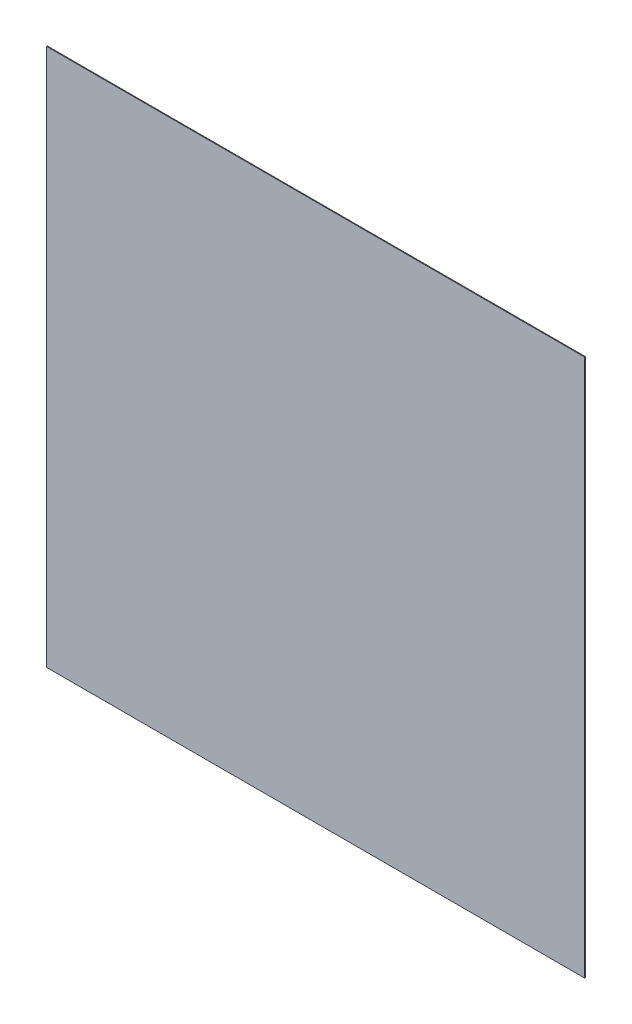
ISO-10303-21;
HEADER;
FILE_DESCRIPTION(('STEP AP214'),'2;1');
FILE_NAME('part.step','',(''),(''),'','','');
FILE_SCHEMA(('AUTOMOTIVE_DESIGN { 1 0 10303 214 1 1 1 1 }'));
ENDSEC;
DATA;
#1=APPLICATION_CONTEXT('core data for automotive mechanical design processes');
#2=APPLICATION_PROTOCOL_DEFINITION('international standard','automotive_design',2000,#1);
#3=PRODUCT_CONTEXT('',#1,'mechanical');
#4=PRODUCT('Part','Part','',(#3));
#5=PRODUCT_RELATED_PRODUCT_CATEGORY('part','',(#4));
#6=PRODUCT_DEFINITION_FORMATION('','',#4);
#7=PRODUCT_DEFINITION_CONTEXT('part definition',#1,'design');
#8=PRODUCT_DEFINITION('design','',#6,#7);
#9=PRODUCT_DEFINITION_SHAPE('','',#8);
#10=(LENGTH_UNIT() NAMED_UNIT(*) SI_UNIT(.MILLI.,.METRE.));
#11=(NAMED_UNIT(*) PLANE_ANGLE_UNIT() SI_UNIT($,.RADIAN.));
#12=(NAMED_UNIT(*) SI_UNIT($,.STERADIAN.) SOLID_ANGLE_UNIT());
#13=UNCERTAINTY_MEASURE_WITH_UNIT(LENGTH_MEASURE(1.E-05),#10,'distance_accuracy_value','');
#14=(GEOMETRIC_REPRESENTATION_CONTEXT(3) GLOBAL_UNCERTAINTY_ASSIGNED_CONTEXT((#13)) GLOBAL_UNIT_ASSIGNED_CONTEXT((#10,
#11,#12)) REPRESENTATION_CONTEXT('',''));
#15=CARTESIAN_POINT('',(0.,0.,0.));
#16=DIRECTION('',(0.,0.,1.));
#17=DIRECTION('',(1.,0.,0.));
#18=AXIS2_PLACEMENT_3D('',#15,#16,#17);
#19=CARTESIAN_POINT('',(0.,0.,1.));
#20=DIRECTION('',(1.,0.,0.));
#21=DIRECTION('',(0.,0.,-1.));
#22=AXIS2_PLACEMENT_3D('',#19,#20,#21);
#23=PLANE('',#22);
#24=DIRECTION('',(0.,-1.,0.));
#25=VECTOR('',#24,1.);
#26=CARTESIAN_POINT('',(0.,0.,0.));
#27=LINE('',#26,#25);
#28=CARTESIAN_POINT('',(0.,700.,0.));
#29=VERTEX_POINT('',#28);
#30=CARTESIAN_POINT('',(0.,0.,0.));
#31=VERTEX_POINT('',#30);
#32=EDGE_CURVE('E96',#29,#31,#27,.T.);
#33=ORIENTED_EDGE('',*,*,#32,.T.);
#34=DIRECTION('',(0.,0.,-1.));
#35=VECTOR('',#34,1.);
#36=CARTESIAN_POINT('',(0.,0.,1.));
#37=LINE('',#36,#35);
#38=CARTESIAN_POINT('',(0.,0.,1.));
#39=VERTEX_POINT('',#38);
#40=EDGE_CURVE('E11',#39,#31,#37,.T.);
#41=ORIENTED_EDGE('',*,*,#40,.F.);
#42=DIRECTION('',(0.,-1.,0.));
#43=VECTOR('',#42,1.);
#44=CARTESIAN_POINT('',(0.,0.,1.));
#45=LINE('',#44,#43);
#46=CARTESIAN_POINT('',(0.,700.,1.));
#47=VERTEX_POINT('',#46);
#48=EDGE_CURVE('E84',#47,#39,#45,.T.);
#49=ORIENTED_EDGE('',*,*,#48,.F.);
#50=DIRECTION('',(0.,0.,-1.));
#51=VECTOR('',#50,1.);
#52=CARTESIAN_POINT('',(0.,700.,1.));
#53=LINE('',#52,#51);
#54=EDGE_CURVE('E92',#47,#29,#53,.T.);
#55=ORIENTED_EDGE('',*,*,#54,.T.);
#56=EDGE_LOOP('',(#33,#41,#49,#55));
#57=FACE_BOUND('',#56,.T.);
#58=ADVANCED_FACE('F33',(#57),#23,.F.);
#59=CARTESIAN_POINT('',(0.,0.,1.));
#60=DIRECTION('',(0.,1.,0.));
#61=DIRECTION('',(0.,0.,1.));
#62=AXIS2_PLACEMENT_3D('',#59,#60,#61);
#63=PLANE('',#62);
#64=DIRECTION('',(1.,0.,0.));
#65=VECTOR('',#64,1.);
#66=CARTESIAN_POINT('',(0.,0.,0.));
#67=LINE('',#66,#65);
#68=CARTESIAN_POINT('',(700.,0.,0.));
#69=VERTEX_POINT('',#68);
#70=EDGE_CURVE('E88',#31,#69,#67,.T.);
#71=ORIENTED_EDGE('',*,*,#70,.T.);
#72=DIRECTION('',(0.,0.,-1.));
#73=VECTOR('',#72,1.);
#74=CARTESIAN_POINT('',(700.,0.,1.));
#75=LINE('',#74,#73);
#76=CARTESIAN_POINT('',(700.,0.,1.));
#77=VERTEX_POINT('',#76);
#78=EDGE_CURVE('E41',#77,#69,#75,.T.);
#79=ORIENTED_EDGE('',*,*,#78,.F.);
#80=DIRECTION('',(1.,0.,0.));
#81=VECTOR('',#80,1.);
#82=CARTESIAN_POINT('',(0.,0.,1.));
#83=LINE('',#82,#81);
#84=EDGE_CURVE('E79',#39,#77,#83,.T.);
#85=ORIENTED_EDGE('',*,*,#84,.F.);
#86=ORIENTED_EDGE('',*,*,#40,.T.);
#87=EDGE_LOOP('',(#71,#79,#85,#86));
#88=FACE_BOUND('',#87,.T.);
#89=ADVANCED_FACE('F87',(#88),#63,.F.);
#90=CARTESIAN_POINT('',(700.,0.,1.));
#91=DIRECTION('',(-1.,0.,0.));
#92=DIRECTION('',(0.,0.,1.));
#93=AXIS2_PLACEMENT_3D('',#90,#91,#92);
#94=PLANE('',#93);
#95=DIRECTION('',(0.,1.,0.));
#96=VECTOR('',#95,1.);
#97=CARTESIAN_POINT('',(700.,0.,0.));
#98=LINE('',#97,#96);
#99=CARTESIAN_POINT('',(700.,700.,0.));
#100=VERTEX_POINT('',#99);
#101=EDGE_CURVE('E66',#69,#100,#98,.T.);
#102=ORIENTED_EDGE('',*,*,#101,.T.);
#103=DIRECTION('',(0.,0.,-1.));
#104=VECTOR('',#103,1.);
#105=CARTESIAN_POINT('',(700.,700.,1.));
#106=LINE('',#105,#104);
#107=CARTESIAN_POINT('',(700.,700.,1.));
#108=VERTEX_POINT('',#107);
#109=EDGE_CURVE('E89',#108,#100,#106,.T.);
#110=ORIENTED_EDGE('',*,*,#109,.F.);
#111=DIRECTION('',(0.,1.,0.));
#112=VECTOR('',#111,1.);
#113=CARTESIAN_POINT('',(700.,0.,1.));
#114=LINE('',#113,#112);
#115=EDGE_CURVE('E82',#77,#108,#114,.T.);
#116=ORIENTED_EDGE('',*,*,#115,.F.);
#117=ORIENTED_EDGE('',*,*,#78,.T.);
#118=EDGE_LOOP('',(#102,#110,#116,#117));
#119=FACE_BOUND('',#118,.T.);
#120=ADVANCED_FACE('F90',(#119),#94,.F.);
#121=CARTESIAN_POINT('',(0.,700.,1.));
#122=DIRECTION('',(0.,-1.,0.));
#123=DIRECTION('',(0.,0.,-1.));
#124=AXIS2_PLACEMENT_3D('',#121,#122,#123);
#125=PLANE('',#124);
#126=DIRECTION('',(-1.,0.,0.));
#127=VECTOR('',#126,1.);
#128=CARTESIAN_POINT('',(0.,700.,0.));
#129=LINE('',#128,#127);
#130=EDGE_CURVE('E72',#100,#29,#129,.T.);
#131=ORIENTED_EDGE('',*,*,#130,.T.);
#132=ORIENTED_EDGE('',*,*,#54,.F.);
#133=DIRECTION('',(-1.,0.,0.));
#134=VECTOR('',#133,1.);
#135=CARTESIAN_POINT('',(0.,700.,1.));
#136=LINE('',#135,#134);
#137=EDGE_CURVE('E49',#108,#47,#136,.T.);
#138=ORIENTED_EDGE('',*,*,#137,.F.);
#139=ORIENTED_EDGE('',*,*,#109,.T.);
#140=EDGE_LOOP('',(#131,#132,#138,#139));
#141=FACE_BOUND('',#140,.T.);
#142=ADVANCED_FACE('F103',(#141),#125,.F.);
#143=CARTESIAN_POINT('',(0.,0.,1.));
#144=DIRECTION('',(0.,0.,-1.));
#145=DIRECTION('',(-1.,0.,0.));
#146=AXIS2_PLACEMENT_3D('',#143,#144,#145);
#147=PLANE('',#146);
#148=ORIENTED_EDGE('',*,*,#48,.T.);
#149=ORIENTED_EDGE('',*,*,#84,.T.);
#150=ORIENTED_EDGE('',*,*,#115,.T.);
#151=ORIENTED_EDGE('',*,*,#137,.T.);
#152=EDGE_LOOP('',(#148,#149,#150,#151));
#153=FACE_BOUND('',#152,.T.);
#154=ADVANCED_FACE('F80',(#153),#147,.F.);
#155=CARTESIAN_POINT('',(0.,0.,0.));
#156=DIRECTION('',(0.,0.,-1.));
#157=DIRECTION('',(-1.,0.,0.));
#158=AXIS2_PLACEMENT_3D('',#155,#156,#157);
#159=PLANE('',#158);
#160=ORIENTED_EDGE('',*,*,#32,.F.);
#161=ORIENTED_EDGE('',*,*,#130,.F.);
#162=ORIENTED_EDGE('',*,*,#101,.F.);
#163=ORIENTED_EDGE('',*,*,#70,.F.);
#164=EDGE_LOOP('',(#160,#161,#162,#163));
#165=FACE_BOUND('',#164,.T.);
#166=ADVANCED_FACE('F106',(#165),#159,.T.);
#167=CLOSED_SHELL('',(#58,#89,#120,#142,#154,#166));
#168=MANIFOLD_SOLID_BREP('B2',#167);
#169=ADVANCED_BREP_SHAPE_REPRESENTATION('',(#18,#168),#14);
#170=SHAPE_DEFINITION_REPRESENTATION(#9,#169);
ENDSEC;
END-ISO-10303-21;
